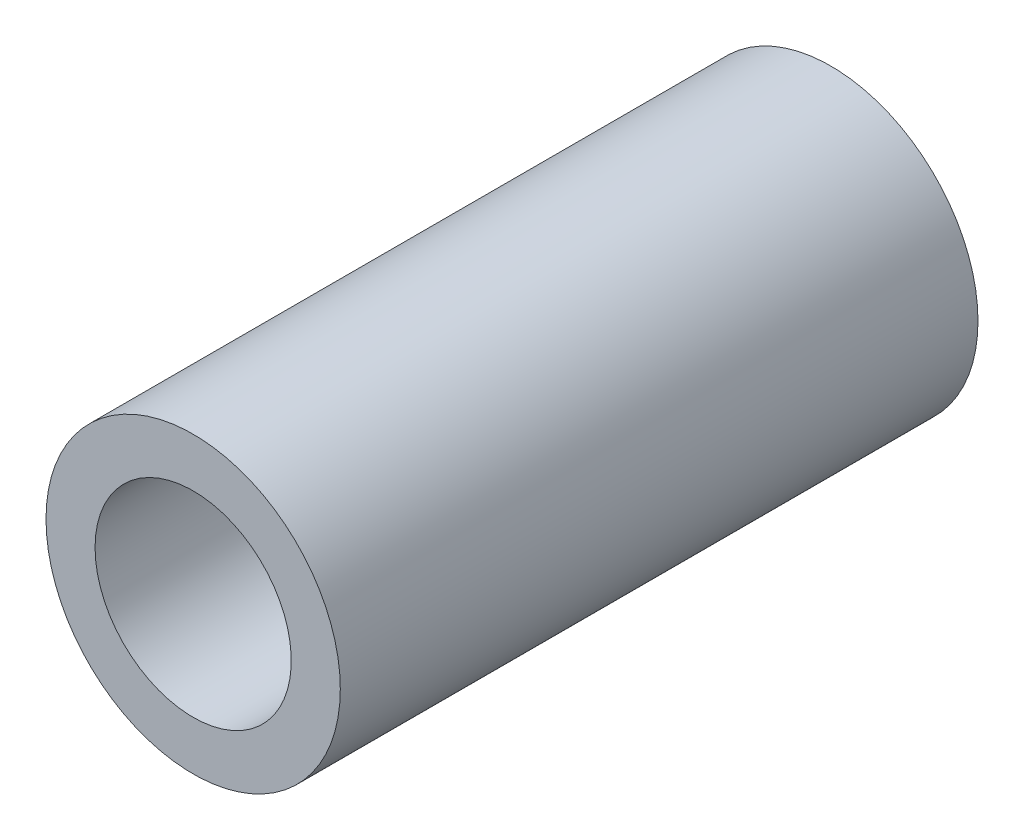
ISO-10303-21;
HEADER;
FILE_DESCRIPTION(('STEP AP214'),'2;1');
FILE_NAME('part.step','',(''),(''),'','','');
FILE_SCHEMA(('AUTOMOTIVE_DESIGN { 1 0 10303 214 1 1 1 1 }'));
ENDSEC;
DATA;
#1=APPLICATION_CONTEXT('core data for automotive mechanical design processes');
#2=APPLICATION_PROTOCOL_DEFINITION('international standard','automotive_design',2000,#1);
#3=PRODUCT_CONTEXT('',#1,'mechanical');
#4=PRODUCT('Part','Part','',(#3));
#5=PRODUCT_RELATED_PRODUCT_CATEGORY('part','',(#4));
#6=PRODUCT_DEFINITION_FORMATION('','',#4);
#7=PRODUCT_DEFINITION_CONTEXT('part definition',#1,'design');
#8=PRODUCT_DEFINITION('design','',#6,#7);
#9=PRODUCT_DEFINITION_SHAPE('','',#8);
#10=(LENGTH_UNIT() NAMED_UNIT(*) SI_UNIT(.MILLI.,.METRE.));
#11=(NAMED_UNIT(*) PLANE_ANGLE_UNIT() SI_UNIT($,.RADIAN.));
#12=(NAMED_UNIT(*) SI_UNIT($,.STERADIAN.) SOLID_ANGLE_UNIT());
#13=UNCERTAINTY_MEASURE_WITH_UNIT(LENGTH_MEASURE(1.E-05),#10,'distance_accuracy_value','');
#14=(GEOMETRIC_REPRESENTATION_CONTEXT(3) GLOBAL_UNCERTAINTY_ASSIGNED_CONTEXT((#13)) GLOBAL_UNIT_ASSIGNED_CONTEXT((#10,
#11,#12)) REPRESENTATION_CONTEXT('',''));
#15=CARTESIAN_POINT('',(0.,0.,0.));
#16=DIRECTION('',(0.,0.,1.));
#17=DIRECTION('',(1.,0.,0.));
#18=AXIS2_PLACEMENT_3D('',#15,#16,#17);
#19=CARTESIAN_POINT('',(0.,0.,13.));
#20=DIRECTION('',(0.,0.,1.));
#21=DIRECTION('',(1.,0.,0.));
#22=AXIS2_PLACEMENT_3D('',#19,#20,#21);
#23=PLANE('',#22);
#24=CARTESIAN_POINT('',(0.,0.,13.));
#25=DIRECTION('',(0.,0.,1.));
#26=DIRECTION('',(1.,0.,0.));
#27=AXIS2_PLACEMENT_3D('',#24,#25,#26);
#28=CIRCLE('',#27,3.);
#29=CARTESIAN_POINT('',(-3.,0.,13.));
#30=VERTEX_POINT('',#29);
#31=EDGE_CURVE('E10',#30,#30,#28,.T.);
#32=ORIENTED_EDGE('',*,*,#31,.T.);
#33=EDGE_LOOP('',(#32));
#34=FACE_BOUND('',#33,.T.);
#35=CARTESIAN_POINT('',(0.,0.,13.));
#36=DIRECTION('',(0.,0.,1.));
#37=DIRECTION('',(1.,0.,0.));
#38=AXIS2_PLACEMENT_3D('',#35,#36,#37);
#39=CIRCLE('',#38,2.);
#40=CARTESIAN_POINT('',(-2.,0.,13.));
#41=VERTEX_POINT('',#40);
#42=EDGE_CURVE('E41',#41,#41,#39,.T.);
#43=ORIENTED_EDGE('',*,*,#42,.F.);
#44=EDGE_LOOP('',(#43));
#45=FACE_BOUND('',#44,.T.);
#46=ADVANCED_FACE('F30',(#34,#45),#23,.T.);
#47=CARTESIAN_POINT('',(0.,0.,0.));
#48=DIRECTION('',(0.,0.,1.));
#49=DIRECTION('',(1.,0.,0.));
#50=AXIS2_PLACEMENT_3D('',#47,#48,#49);
#51=PLANE('',#50);
#52=CARTESIAN_POINT('',(0.,0.,0.));
#53=DIRECTION('',(0.,0.,1.));
#54=DIRECTION('',(1.,0.,0.));
#55=AXIS2_PLACEMENT_3D('',#52,#53,#54);
#56=CIRCLE('',#55,3.);
#57=CARTESIAN_POINT('',(-3.,0.,0.));
#58=VERTEX_POINT('',#57);
#59=EDGE_CURVE('E34',#58,#58,#56,.T.);
#60=ORIENTED_EDGE('',*,*,#59,.F.);
#61=EDGE_LOOP('',(#60));
#62=FACE_BOUND('',#61,.T.);
#63=CARTESIAN_POINT('',(0.,0.,0.));
#64=DIRECTION('',(0.,0.,1.));
#65=DIRECTION('',(1.,0.,0.));
#66=AXIS2_PLACEMENT_3D('',#63,#64,#65);
#67=CIRCLE('',#66,2.);
#68=CARTESIAN_POINT('',(-2.,0.,0.));
#69=VERTEX_POINT('',#68);
#70=EDGE_CURVE('E43',#69,#69,#67,.T.);
#71=ORIENTED_EDGE('',*,*,#70,.T.);
#72=EDGE_LOOP('',(#71));
#73=FACE_BOUND('',#72,.T.);
#74=ADVANCED_FACE('F53',(#62,#73),#51,.F.);
#75=CARTESIAN_POINT('',(0.,0.,13.));
#76=DIRECTION('',(0.,0.,-1.));
#77=DIRECTION('',(-1.,0.,0.));
#78=AXIS2_PLACEMENT_3D('',#75,#76,#77);
#79=CYLINDRICAL_SURFACE('',#78,3.);
#80=CARTESIAN_POINT('',(-3.,0.,13.));
#81=CARTESIAN_POINT('',(-3.,0.,12.8645833333333));
#82=CARTESIAN_POINT('',(-3.,0.,12.7291666666667));
#83=CARTESIAN_POINT('',(-3.,0.,12.4583333333333));
#84=CARTESIAN_POINT('',(-3.,0.,12.3229166666667));
#85=CARTESIAN_POINT('',(-3.,0.,12.0520833333333));
#86=CARTESIAN_POINT('',(-3.,0.,11.9166666666667));
#87=CARTESIAN_POINT('',(-3.,0.,11.6458333333333));
#88=CARTESIAN_POINT('',(-3.,0.,11.5104166666667));
#89=CARTESIAN_POINT('',(-3.,0.,11.2395833333333));
#90=CARTESIAN_POINT('',(-3.,0.,11.1041666666667));
#91=CARTESIAN_POINT('',(-3.,0.,10.8333333333333));
#92=CARTESIAN_POINT('',(-3.,0.,10.6979166666667));
#93=CARTESIAN_POINT('',(-3.,0.,10.4270833333333));
#94=CARTESIAN_POINT('',(-3.,0.,10.2916666666667));
#95=CARTESIAN_POINT('',(-3.,0.,10.0208333333333));
#96=CARTESIAN_POINT('',(-3.,0.,9.88541666666667));
#97=CARTESIAN_POINT('',(-3.,0.,9.61458333333333));
#98=CARTESIAN_POINT('',(-3.,0.,9.47916666666667));
#99=CARTESIAN_POINT('',(-3.,0.,9.20833333333333));
#100=CARTESIAN_POINT('',(-3.,0.,9.07291666666667));
#101=CARTESIAN_POINT('',(-3.,0.,8.80208333333333));
#102=CARTESIAN_POINT('',(-3.,0.,8.66666666666667));
#103=CARTESIAN_POINT('',(-3.,0.,8.39583333333333));
#104=CARTESIAN_POINT('',(-3.,0.,8.26041666666667));
#105=CARTESIAN_POINT('',(-3.,0.,7.98958333333333));
#106=CARTESIAN_POINT('',(-3.,0.,7.85416666666667));
#107=CARTESIAN_POINT('',(-3.,0.,7.58333333333333));
#108=CARTESIAN_POINT('',(-3.,0.,7.44791666666667));
#109=CARTESIAN_POINT('',(-3.,0.,7.17708333333333));
#110=CARTESIAN_POINT('',(-3.,0.,7.04166666666667));
#111=CARTESIAN_POINT('',(-3.,0.,6.77083333333333));
#112=CARTESIAN_POINT('',(-3.,0.,6.63541666666667));
#113=CARTESIAN_POINT('',(-3.,0.,6.36458333333333));
#114=CARTESIAN_POINT('',(-3.,0.,6.22916666666667));
#115=CARTESIAN_POINT('',(-3.,0.,5.95833333333333));
#116=CARTESIAN_POINT('',(-3.,0.,5.82291666666667));
#117=CARTESIAN_POINT('',(-3.,0.,5.55208333333333));
#118=CARTESIAN_POINT('',(-3.,0.,5.41666666666667));
#119=CARTESIAN_POINT('',(-3.,0.,5.14583333333333));
#120=CARTESIAN_POINT('',(-3.,0.,5.01041666666667));
#121=CARTESIAN_POINT('',(-3.,0.,4.73958333333333));
#122=CARTESIAN_POINT('',(-3.,0.,4.60416666666667));
#123=CARTESIAN_POINT('',(-3.,0.,4.33333333333333));
#124=CARTESIAN_POINT('',(-3.,0.,4.19791666666667));
#125=CARTESIAN_POINT('',(-3.,0.,3.92708333333333));
#126=CARTESIAN_POINT('',(-3.,0.,3.79166666666667));
#127=CARTESIAN_POINT('',(-3.,0.,3.52083333333333));
#128=CARTESIAN_POINT('',(-3.,0.,3.38541666666667));
#129=CARTESIAN_POINT('',(-3.,0.,3.11458333333333));
#130=CARTESIAN_POINT('',(-3.,0.,2.97916666666667));
#131=CARTESIAN_POINT('',(-3.,0.,2.70833333333333));
#132=CARTESIAN_POINT('',(-3.,0.,2.57291666666667));
#133=CARTESIAN_POINT('',(-3.,0.,2.30208333333333));
#134=CARTESIAN_POINT('',(-3.,0.,2.16666666666667));
#135=CARTESIAN_POINT('',(-3.,0.,1.89583333333333));
#136=CARTESIAN_POINT('',(-3.,0.,1.76041666666667));
#137=CARTESIAN_POINT('',(-3.,0.,1.48958333333333));
#138=CARTESIAN_POINT('',(-3.,0.,1.35416666666667));
#139=CARTESIAN_POINT('',(-3.,0.,1.08333333333333));
#140=CARTESIAN_POINT('',(-3.,0.,0.947916666666667));
#141=CARTESIAN_POINT('',(-3.,0.,0.677083333333334));
#142=CARTESIAN_POINT('',(-3.,0.,0.541666666666667));
#143=CARTESIAN_POINT('',(-3.,0.,0.270833333333334));
#144=CARTESIAN_POINT('',(-3.,0.,0.135416666666667));
#145=CARTESIAN_POINT('',(-3.,0.,0.));
#146=B_SPLINE_CURVE_WITH_KNOTS('',3,(#80,#81,#82,#83,#84,#85,#86,#87,#88,#89,#90,#91,#92,#93,
#94,#95,#96,#97,#98,#99,#100,#101,#102,#103,#104,#105,#106,#107,#108,#109,#110,#111,#112,#113,
#114,#115,#116,#117,#118,#119,#120,#121,#122,#123,#124,#125,#126,#127,#128,#129,#130,#131,#132,
#133,#134,#135,#136,#137,#138,#139,#140,#141,#142,#143,#144,#145),.UNSPECIFIED.,.F.,.F.,(4,2,2,
2,2,2,2,2,2,2,2,2,2,2,2,2,2,2,2,2,2,2,2,2,2,2,2,2,2,2,2,2,4),(0.,0.406249999999999,
0.812499999999999,1.21875,1.625,2.03125,2.4375,2.84375,3.25,3.65625,4.0625,4.46875,4.875,
5.28125,5.6875,6.09375,6.5,6.90625,7.3125,7.71875,8.125,8.53125,8.9375,9.34375,9.75,10.15625,
10.5625,10.96875,11.375,11.78125,12.1875,12.59375,13.),.UNSPECIFIED.);
#147=EDGE_CURVE('BSEAM32',#30,#58,#146,.T.);
#148=ORIENTED_EDGE('',*,*,#31,.F.);
#149=ORIENTED_EDGE('',*,*,#59,.T.);
#150=ORIENTED_EDGE('',*,*,#147,.T.);
#151=ORIENTED_EDGE('',*,*,#147,.F.);
#152=EDGE_LOOP('',(#148,#150,#149,#151));
#153=FACE_BOUND('',#152,.T.);
#154=ADVANCED_FACE('F32',(#153),#79,.T.);
#155=CARTESIAN_POINT('',(0.,0.,13.));
#156=DIRECTION('',(0.,0.,-1.));
#157=DIRECTION('',(-1.,0.,0.));
#158=AXIS2_PLACEMENT_3D('',#155,#156,#157);
#159=CYLINDRICAL_SURFACE('',#158,2.);
#160=CARTESIAN_POINT('',(-2.,0.,13.));
#161=CARTESIAN_POINT('',(-2.,0.,12.8645833333333));
#162=CARTESIAN_POINT('',(-2.,0.,12.7291666666667));
#163=CARTESIAN_POINT('',(-2.,0.,12.4583333333333));
#164=CARTESIAN_POINT('',(-2.,0.,12.3229166666667));
#165=CARTESIAN_POINT('',(-2.,0.,12.0520833333333));
#166=CARTESIAN_POINT('',(-2.,0.,11.9166666666667));
#167=CARTESIAN_POINT('',(-2.,0.,11.6458333333333));
#168=CARTESIAN_POINT('',(-2.,0.,11.5104166666667));
#169=CARTESIAN_POINT('',(-2.,0.,11.2395833333333));
#170=CARTESIAN_POINT('',(-2.,0.,11.1041666666667));
#171=CARTESIAN_POINT('',(-2.,0.,10.8333333333333));
#172=CARTESIAN_POINT('',(-2.,0.,10.6979166666667));
#173=CARTESIAN_POINT('',(-2.,0.,10.4270833333333));
#174=CARTESIAN_POINT('',(-2.,0.,10.2916666666667));
#175=CARTESIAN_POINT('',(-2.,0.,10.0208333333333));
#176=CARTESIAN_POINT('',(-2.,0.,9.88541666666667));
#177=CARTESIAN_POINT('',(-2.,0.,9.61458333333333));
#178=CARTESIAN_POINT('',(-2.,0.,9.47916666666667));
#179=CARTESIAN_POINT('',(-2.,0.,9.20833333333333));
#180=CARTESIAN_POINT('',(-2.,0.,9.07291666666666));
#181=CARTESIAN_POINT('',(-2.,0.,8.80208333333333));
#182=CARTESIAN_POINT('',(-2.,0.,8.66666666666667));
#183=CARTESIAN_POINT('',(-2.,0.,8.39583333333333));
#184=CARTESIAN_POINT('',(-2.,0.,8.26041666666667));
#185=CARTESIAN_POINT('',(-2.,0.,7.98958333333333));
#186=CARTESIAN_POINT('',(-2.,0.,7.85416666666667));
#187=CARTESIAN_POINT('',(-2.,0.,7.58333333333333));
#188=CARTESIAN_POINT('',(-2.,0.,7.44791666666667));
#189=CARTESIAN_POINT('',(-2.,0.,7.17708333333333));
#190=CARTESIAN_POINT('',(-2.,0.,7.04166666666667));
#191=CARTESIAN_POINT('',(-2.,0.,6.77083333333333));
#192=CARTESIAN_POINT('',(-2.,0.,6.63541666666667));
#193=CARTESIAN_POINT('',(-2.,0.,6.36458333333333));
#194=CARTESIAN_POINT('',(-2.,0.,6.22916666666667));
#195=CARTESIAN_POINT('',(-2.,0.,5.95833333333333));
#196=CARTESIAN_POINT('',(-2.,0.,5.82291666666667));
#197=CARTESIAN_POINT('',(-2.,0.,5.55208333333333));
#198=CARTESIAN_POINT('',(-2.,0.,5.41666666666667));
#199=CARTESIAN_POINT('',(-2.,0.,5.14583333333333));
#200=CARTESIAN_POINT('',(-2.,0.,5.01041666666667));
#201=CARTESIAN_POINT('',(-2.,0.,4.73958333333333));
#202=CARTESIAN_POINT('',(-2.,0.,4.60416666666667));
#203=CARTESIAN_POINT('',(-2.,0.,4.33333333333333));
#204=CARTESIAN_POINT('',(-2.,0.,4.19791666666667));
#205=CARTESIAN_POINT('',(-2.,0.,3.92708333333333));
#206=CARTESIAN_POINT('',(-2.,0.,3.79166666666667));
#207=CARTESIAN_POINT('',(-2.,0.,3.52083333333333));
#208=CARTESIAN_POINT('',(-2.,0.,3.38541666666667));
#209=CARTESIAN_POINT('',(-2.,0.,3.11458333333333));
#210=CARTESIAN_POINT('',(-2.,0.,2.97916666666667));
#211=CARTESIAN_POINT('',(-2.,0.,2.70833333333333));
#212=CARTESIAN_POINT('',(-2.,0.,2.57291666666667));
#213=CARTESIAN_POINT('',(-2.,0.,2.30208333333333));
#214=CARTESIAN_POINT('',(-2.,0.,2.16666666666667));
#215=CARTESIAN_POINT('',(-2.,0.,1.89583333333333));
#216=CARTESIAN_POINT('',(-2.,0.,1.76041666666667));
#217=CARTESIAN_POINT('',(-2.,0.,1.48958333333333));
#218=CARTESIAN_POINT('',(-2.,0.,1.35416666666667));
#219=CARTESIAN_POINT('',(-2.,0.,1.08333333333333));
#220=CARTESIAN_POINT('',(-2.,0.,0.947916666666667));
#221=CARTESIAN_POINT('',(-2.,0.,0.677083333333334));
#222=CARTESIAN_POINT('',(-2.,0.,0.541666666666667));
#223=CARTESIAN_POINT('',(-2.,0.,0.270833333333334));
#224=CARTESIAN_POINT('',(-2.,0.,0.135416666666667));
#225=CARTESIAN_POINT('',(-2.,0.,0.));
#226=B_SPLINE_CURVE_WITH_KNOTS('',3,(#160,#161,#162,#163,#164,#165,#166,#167,#168,#169,#170,
#171,#172,#173,#174,#175,#176,#177,#178,#179,#180,#181,#182,#183,#184,#185,#186,#187,#188,#189,
#190,#191,#192,#193,#194,#195,#196,#197,#198,#199,#200,#201,#202,#203,#204,#205,#206,#207,#208,
#209,#210,#211,#212,#213,#214,#215,#216,#217,#218,#219,#220,#221,#222,#223,#224,#225),
.UNSPECIFIED.,.F.,.F.,(4,2,2,2,2,2,2,2,2,2,2,2,2,2,2,2,2,2,2,2,2,2,2,2,2,2,2,2,2,2,2,2,4),(0.,
0.40625,0.812500000000001,1.21875,1.625,2.03125,2.4375,2.84375,3.25,3.65625,4.0625,4.46875,
4.875,5.28125,5.6875,6.09375,6.5,6.90625,7.3125,7.71875,8.125,8.53125,8.9375,9.34375,9.75,
10.15625,10.5625,10.96875,11.375,11.78125,12.1875,12.59375,13.),.UNSPECIFIED.);
#227=EDGE_CURVE('BSEAM49',#41,#69,#226,.T.);
#228=ORIENTED_EDGE('',*,*,#42,.T.);
#229=ORIENTED_EDGE('',*,*,#70,.F.);
#230=ORIENTED_EDGE('',*,*,#227,.T.);
#231=ORIENTED_EDGE('',*,*,#227,.F.);
#232=EDGE_LOOP('',(#228,#230,#229,#231));
#233=FACE_BOUND('',#232,.T.);
#234=ADVANCED_FACE('F49',(#233),#159,.F.);
#235=CLOSED_SHELL('',(#46,#74,#154,#234));
#236=MANIFOLD_SOLID_BREP('B2',#235);
#237=ADVANCED_BREP_SHAPE_REPRESENTATION('',(#18,#236),#14);
#238=SHAPE_DEFINITION_REPRESENTATION(#9,#237);
ENDSEC;
END-ISO-10303-21;
